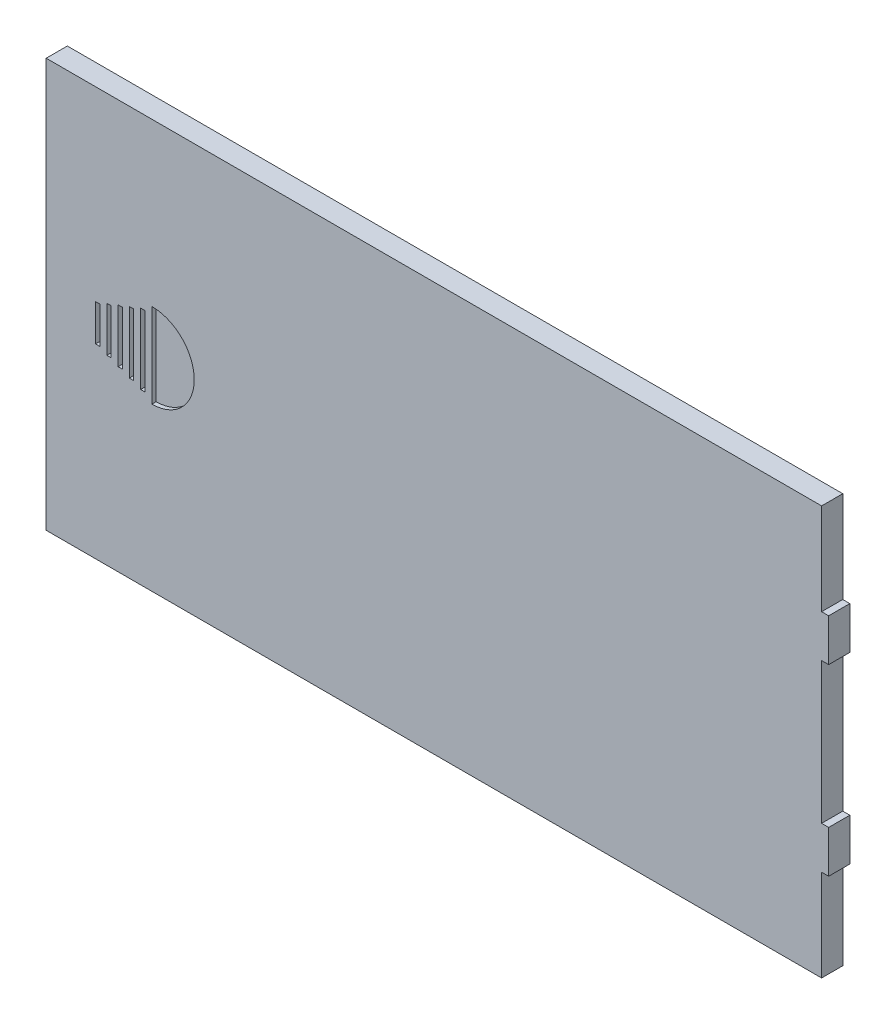
ISO-10303-21;
HEADER;
FILE_DESCRIPTION(('STEP AP214'),'2;1');
FILE_NAME('part.step','',(''),(''),'','','');
FILE_SCHEMA(('AUTOMOTIVE_DESIGN { 1 0 10303 214 1 1 1 1 }'));
ENDSEC;
DATA;
#1=APPLICATION_CONTEXT('core data for automotive mechanical design processes');
#2=APPLICATION_PROTOCOL_DEFINITION('international standard','automotive_design',2000,#1);
#3=PRODUCT_CONTEXT('',#1,'mechanical');
#4=PRODUCT('Part','Part','',(#3));
#5=PRODUCT_RELATED_PRODUCT_CATEGORY('part','',(#4));
#6=PRODUCT_DEFINITION_FORMATION('','',#4);
#7=PRODUCT_DEFINITION_CONTEXT('part definition',#1,'design');
#8=PRODUCT_DEFINITION('design','',#6,#7);
#9=PRODUCT_DEFINITION_SHAPE('','',#8);
#10=(LENGTH_UNIT() NAMED_UNIT(*) SI_UNIT(.MILLI.,.METRE.));
#11=(NAMED_UNIT(*) PLANE_ANGLE_UNIT() SI_UNIT($,.RADIAN.));
#12=(NAMED_UNIT(*) SI_UNIT($,.STERADIAN.) SOLID_ANGLE_UNIT());
#13=UNCERTAINTY_MEASURE_WITH_UNIT(LENGTH_MEASURE(1.E-05),#10,'distance_accuracy_value','');
#14=(GEOMETRIC_REPRESENTATION_CONTEXT(3) GLOBAL_UNCERTAINTY_ASSIGNED_CONTEXT((#13)) GLOBAL_UNIT_ASSIGNED_CONTEXT((#10,
#11,#12)) REPRESENTATION_CONTEXT('',''));
#15=CARTESIAN_POINT('',(0.,0.,0.));
#16=DIRECTION('',(0.,0.,1.));
#17=DIRECTION('',(1.,0.,0.));
#18=AXIS2_PLACEMENT_3D('',#15,#16,#17);
#19=CARTESIAN_POINT('',(27.5,-8.,1.5));
#20=DIRECTION('',(-1.,0.,0.));
#21=DIRECTION('',(0.,-1.,0.));
#22=AXIS2_PLACEMENT_3D('',#19,#20,#21);
#23=PLANE('',#22);
#24=DIRECTION('',(0.,1.,0.));
#25=VECTOR('',#24,1.);
#26=CARTESIAN_POINT('',(27.5,-8.,0.));
#27=LINE('',#26,#25);
#28=CARTESIAN_POINT('',(27.5,-14.5,0.));
#29=VERTEX_POINT('',#28);
#30=CARTESIAN_POINT('',(27.5,-8.,0.));
#31=VERTEX_POINT('',#30);
#32=EDGE_CURVE('E434',#29,#31,#27,.T.);
#33=ORIENTED_EDGE('',*,*,#32,.T.);
#34=DIRECTION('',(0.,0.,-1.));
#35=VECTOR('',#34,1.);
#36=CARTESIAN_POINT('',(27.5,-8.,1.5));
#37=LINE('',#36,#35);
#38=CARTESIAN_POINT('',(27.5,-8.,1.5));
#39=VERTEX_POINT('',#38);
#40=EDGE_CURVE('E11',#39,#31,#37,.T.);
#41=ORIENTED_EDGE('',*,*,#40,.F.);
#42=DIRECTION('',(0.,1.,0.));
#43=VECTOR('',#42,1.);
#44=CARTESIAN_POINT('',(27.5,-8.,1.5));
#45=LINE('',#44,#43);
#46=CARTESIAN_POINT('',(27.5,-14.5,1.5));
#47=VERTEX_POINT('',#46);
#48=EDGE_CURVE('E437',#47,#39,#45,.T.);
#49=ORIENTED_EDGE('',*,*,#48,.F.);
#50=DIRECTION('',(0.,0.,-1.));
#51=VECTOR('',#50,1.);
#52=CARTESIAN_POINT('',(27.5,-14.5,1.5));
#53=LINE('',#52,#51);
#54=EDGE_CURVE('E463',#47,#29,#53,.T.);
#55=ORIENTED_EDGE('',*,*,#54,.T.);
#56=EDGE_LOOP('',(#33,#41,#49,#55));
#57=FACE_BOUND('',#56,.T.);
#58=ADVANCED_FACE('F36',(#57),#23,.F.);
#59=CARTESIAN_POINT('',(27.5,-8.,1.5));
#60=DIRECTION('',(0.,1.,0.));
#61=DIRECTION('',(0.,0.,1.));
#62=AXIS2_PLACEMENT_3D('',#59,#60,#61);
#63=PLANE('',#62);
#64=DIRECTION('',(1.,0.,0.));
#65=VECTOR('',#64,1.);
#66=CARTESIAN_POINT('',(27.5,-8.,0.));
#67=LINE('',#66,#65);
#68=CARTESIAN_POINT('',(28.,-8.,0.));
#69=VERTEX_POINT('',#68);
#70=EDGE_CURVE('E466',#31,#69,#67,.T.);
#71=ORIENTED_EDGE('',*,*,#70,.T.);
#72=DIRECTION('',(0.,0.,-1.));
#73=VECTOR('',#72,1.);
#74=CARTESIAN_POINT('',(28.,-8.,1.5));
#75=LINE('',#74,#73);
#76=CARTESIAN_POINT('',(28.,-8.,1.5));
#77=VERTEX_POINT('',#76);
#78=EDGE_CURVE('E43',#77,#69,#75,.T.);
#79=ORIENTED_EDGE('',*,*,#78,.F.);
#80=DIRECTION('',(1.,0.,0.));
#81=VECTOR('',#80,1.);
#82=CARTESIAN_POINT('',(27.5,-8.,1.5));
#83=LINE('',#82,#81);
#84=EDGE_CURVE('E440',#39,#77,#83,.T.);
#85=ORIENTED_EDGE('',*,*,#84,.F.);
#86=ORIENTED_EDGE('',*,*,#40,.T.);
#87=EDGE_LOOP('',(#71,#79,#85,#86));
#88=FACE_BOUND('',#87,.T.);
#89=ADVANCED_FACE('F543',(#88),#63,.F.);
#90=CARTESIAN_POINT('',(28.,-8.,1.5));
#91=DIRECTION('',(-1.,0.,0.));
#92=DIRECTION('',(0.,0.,1.));
#93=AXIS2_PLACEMENT_3D('',#90,#91,#92);
#94=PLANE('',#93);
#95=DIRECTION('',(0.,1.,0.));
#96=VECTOR('',#95,1.);
#97=CARTESIAN_POINT('',(28.,-8.,0.));
#98=LINE('',#97,#96);
#99=CARTESIAN_POINT('',(28.,-4.99999999999999,0.));
#100=VERTEX_POINT('',#99);
#101=EDGE_CURVE('E468',#69,#100,#98,.T.);
#102=ORIENTED_EDGE('',*,*,#101,.T.);
#103=DIRECTION('',(0.,0.,-1.));
#104=VECTOR('',#103,1.);
#105=CARTESIAN_POINT('',(28.,-4.99999999999999,1.5));
#106=LINE('',#105,#104);
#107=CARTESIAN_POINT('',(28.,-4.99999999999999,1.5));
#108=VERTEX_POINT('',#107);
#109=EDGE_CURVE('E513',#108,#100,#106,.T.);
#110=ORIENTED_EDGE('',*,*,#109,.F.);
#111=DIRECTION('',(0.,1.,0.));
#112=VECTOR('',#111,1.);
#113=CARTESIAN_POINT('',(28.,-8.,1.5));
#114=LINE('',#113,#112);
#115=EDGE_CURVE('E443',#77,#108,#114,.T.);
#116=ORIENTED_EDGE('',*,*,#115,.F.);
#117=ORIENTED_EDGE('',*,*,#78,.T.);
#118=EDGE_LOOP('',(#102,#110,#116,#117));
#119=FACE_BOUND('',#118,.T.);
#120=ADVANCED_FACE('F520',(#119),#94,.F.);
#121=CARTESIAN_POINT('',(28.,-4.99999999999999,1.5));
#122=DIRECTION('',(0.,-1.,0.));
#123=DIRECTION('',(0.,0.,-1.));
#124=AXIS2_PLACEMENT_3D('',#121,#122,#123);
#125=PLANE('',#124);
#126=DIRECTION('',(-1.,0.,0.));
#127=VECTOR('',#126,1.);
#128=CARTESIAN_POINT('',(28.,-4.99999999999999,0.));
#129=LINE('',#128,#127);
#130=CARTESIAN_POINT('',(27.5,-4.99999999999999,0.));
#131=VERTEX_POINT('',#130);
#132=EDGE_CURVE('E470',#100,#131,#129,.T.);
#133=ORIENTED_EDGE('',*,*,#132,.T.);
#134=DIRECTION('',(0.,0.,-1.));
#135=VECTOR('',#134,1.);
#136=CARTESIAN_POINT('',(27.5,-4.99999999999999,1.5));
#137=LINE('',#136,#135);
#138=CARTESIAN_POINT('',(27.5,-4.99999999999999,1.5));
#139=VERTEX_POINT('',#138);
#140=EDGE_CURVE('E510',#139,#131,#137,.T.);
#141=ORIENTED_EDGE('',*,*,#140,.F.);
#142=DIRECTION('',(-1.,0.,0.));
#143=VECTOR('',#142,1.);
#144=CARTESIAN_POINT('',(28.,-4.99999999999999,1.5));
#145=LINE('',#144,#143);
#146=EDGE_CURVE('E445',#108,#139,#145,.T.);
#147=ORIENTED_EDGE('',*,*,#146,.F.);
#148=ORIENTED_EDGE('',*,*,#109,.T.);
#149=EDGE_LOOP('',(#133,#141,#147,#148));
#150=FACE_BOUND('',#149,.T.);
#151=ADVANCED_FACE('F531',(#150),#125,.F.);
#152=CARTESIAN_POINT('',(27.5,5.,1.5));
#153=DIRECTION('',(-1.,0.,0.));
#154=DIRECTION('',(0.,0.,1.));
#155=AXIS2_PLACEMENT_3D('',#152,#153,#154);
#156=PLANE('',#155);
#157=DIRECTION('',(0.,1.,0.));
#158=VECTOR('',#157,1.);
#159=CARTESIAN_POINT('',(27.5,5.,0.));
#160=LINE('',#159,#158);
#161=CARTESIAN_POINT('',(27.5,5.,0.));
#162=VERTEX_POINT('',#161);
#163=EDGE_CURVE('E472',#131,#162,#160,.T.);
#164=ORIENTED_EDGE('',*,*,#163,.T.);
#165=DIRECTION('',(0.,0.,-1.));
#166=VECTOR('',#165,1.);
#167=CARTESIAN_POINT('',(27.5,5.,1.5));
#168=LINE('',#167,#166);
#169=CARTESIAN_POINT('',(27.5,5.,1.5));
#170=VERTEX_POINT('',#169);
#171=EDGE_CURVE('E507',#170,#162,#168,.T.);
#172=ORIENTED_EDGE('',*,*,#171,.F.);
#173=DIRECTION('',(0.,1.,0.));
#174=VECTOR('',#173,1.);
#175=CARTESIAN_POINT('',(27.5,5.,1.5));
#176=LINE('',#175,#174);
#177=EDGE_CURVE('E447',#139,#170,#176,.T.);
#178=ORIENTED_EDGE('',*,*,#177,.F.);
#179=ORIENTED_EDGE('',*,*,#140,.T.);
#180=EDGE_LOOP('',(#164,#172,#178,#179));
#181=FACE_BOUND('',#180,.T.);
#182=ADVANCED_FACE('F535',(#181),#156,.F.);
#183=CARTESIAN_POINT('',(28.,5.,1.5));
#184=DIRECTION('',(0.,1.,0.));
#185=DIRECTION('',(0.,0.,1.));
#186=AXIS2_PLACEMENT_3D('',#183,#184,#185);
#187=PLANE('',#186);
#188=DIRECTION('',(1.,0.,0.));
#189=VECTOR('',#188,1.);
#190=CARTESIAN_POINT('',(28.,5.,0.));
#191=LINE('',#190,#189);
#192=CARTESIAN_POINT('',(28.,5.,0.));
#193=VERTEX_POINT('',#192);
#194=EDGE_CURVE('E474',#162,#193,#191,.T.);
#195=ORIENTED_EDGE('',*,*,#194,.T.);
#196=DIRECTION('',(0.,0.,-1.));
#197=VECTOR('',#196,1.);
#198=CARTESIAN_POINT('',(28.,5.,1.5));
#199=LINE('',#198,#197);
#200=CARTESIAN_POINT('',(28.,5.,1.5));
#201=VERTEX_POINT('',#200);
#202=EDGE_CURVE('E504',#201,#193,#199,.T.);
#203=ORIENTED_EDGE('',*,*,#202,.F.);
#204=DIRECTION('',(1.,0.,0.));
#205=VECTOR('',#204,1.);
#206=CARTESIAN_POINT('',(28.,5.,1.5));
#207=LINE('',#206,#205);
#208=EDGE_CURVE('E449',#170,#201,#207,.T.);
#209=ORIENTED_EDGE('',*,*,#208,.F.);
#210=ORIENTED_EDGE('',*,*,#171,.T.);
#211=EDGE_LOOP('',(#195,#203,#209,#210));
#212=FACE_BOUND('',#211,.T.);
#213=ADVANCED_FACE('F576',(#212),#187,.F.);
#214=CARTESIAN_POINT('',(28.,8.,1.5));
#215=DIRECTION('',(-1.,0.,0.));
#216=DIRECTION('',(0.,0.,1.));
#217=AXIS2_PLACEMENT_3D('',#214,#215,#216);
#218=PLANE('',#217);
#219=DIRECTION('',(0.,1.,0.));
#220=VECTOR('',#219,1.);
#221=CARTESIAN_POINT('',(28.,8.,0.));
#222=LINE('',#221,#220);
#223=CARTESIAN_POINT('',(28.,8.,0.));
#224=VERTEX_POINT('',#223);
#225=EDGE_CURVE('E476',#193,#224,#222,.T.);
#226=ORIENTED_EDGE('',*,*,#225,.T.);
#227=DIRECTION('',(0.,0.,-1.));
#228=VECTOR('',#227,1.);
#229=CARTESIAN_POINT('',(28.,8.,1.5));
#230=LINE('',#229,#228);
#231=CARTESIAN_POINT('',(28.,8.,1.5));
#232=VERTEX_POINT('',#231);
#233=EDGE_CURVE('E501',#232,#224,#230,.T.);
#234=ORIENTED_EDGE('',*,*,#233,.F.);
#235=DIRECTION('',(0.,1.,0.));
#236=VECTOR('',#235,1.);
#237=CARTESIAN_POINT('',(28.,8.,1.5));
#238=LINE('',#237,#236);
#239=EDGE_CURVE('E451',#201,#232,#238,.T.);
#240=ORIENTED_EDGE('',*,*,#239,.F.);
#241=ORIENTED_EDGE('',*,*,#202,.T.);
#242=EDGE_LOOP('',(#226,#234,#240,#241));
#243=FACE_BOUND('',#242,.T.);
#244=ADVANCED_FACE('F574',(#243),#218,.F.);
#245=CARTESIAN_POINT('',(27.5,8.,1.5));
#246=DIRECTION('',(0.,-1.,0.));
#247=DIRECTION('',(0.,0.,-1.));
#248=AXIS2_PLACEMENT_3D('',#245,#246,#247);
#249=PLANE('',#248);
#250=DIRECTION('',(-1.,0.,0.));
#251=VECTOR('',#250,1.);
#252=CARTESIAN_POINT('',(27.5,8.,0.));
#253=LINE('',#252,#251);
#254=CARTESIAN_POINT('',(27.5,8.,0.));
#255=VERTEX_POINT('',#254);
#256=EDGE_CURVE('E478',#224,#255,#253,.T.);
#257=ORIENTED_EDGE('',*,*,#256,.T.);
#258=DIRECTION('',(0.,0.,-1.));
#259=VECTOR('',#258,1.);
#260=CARTESIAN_POINT('',(27.5,8.,1.5));
#261=LINE('',#260,#259);
#262=CARTESIAN_POINT('',(27.5,8.,1.5));
#263=VERTEX_POINT('',#262);
#264=EDGE_CURVE('E498',#263,#255,#261,.T.);
#265=ORIENTED_EDGE('',*,*,#264,.F.);
#266=DIRECTION('',(-1.,0.,0.));
#267=VECTOR('',#266,1.);
#268=CARTESIAN_POINT('',(27.5,8.,1.5));
#269=LINE('',#268,#267);
#270=EDGE_CURVE('E453',#232,#263,#269,.T.);
#271=ORIENTED_EDGE('',*,*,#270,.F.);
#272=ORIENTED_EDGE('',*,*,#233,.T.);
#273=EDGE_LOOP('',(#257,#265,#271,#272));
#274=FACE_BOUND('',#273,.T.);
#275=ADVANCED_FACE('F570',(#274),#249,.F.);
#276=CARTESIAN_POINT('',(27.5,14.5,1.5));
#277=DIRECTION('',(-1.,0.,0.));
#278=DIRECTION('',(0.,-1.,0.));
#279=AXIS2_PLACEMENT_3D('',#276,#277,#278);
#280=PLANE('',#279);
#281=DIRECTION('',(0.,1.,0.));
#282=VECTOR('',#281,1.);
#283=CARTESIAN_POINT('',(27.5,14.5,0.));
#284=LINE('',#283,#282);
#285=CARTESIAN_POINT('',(27.5,14.5,0.));
#286=VERTEX_POINT('',#285);
#287=EDGE_CURVE('E480',#255,#286,#284,.T.);
#288=ORIENTED_EDGE('',*,*,#287,.T.);
#289=DIRECTION('',(0.,0.,-1.));
#290=VECTOR('',#289,1.);
#291=CARTESIAN_POINT('',(27.5,14.5,1.5));
#292=LINE('',#291,#290);
#293=CARTESIAN_POINT('',(27.5,14.5,1.5));
#294=VERTEX_POINT('',#293);
#295=EDGE_CURVE('E495',#294,#286,#292,.T.);
#296=ORIENTED_EDGE('',*,*,#295,.F.);
#297=DIRECTION('',(0.,1.,0.));
#298=VECTOR('',#297,1.);
#299=CARTESIAN_POINT('',(27.5,14.5,1.5));
#300=LINE('',#299,#298);
#301=EDGE_CURVE('E455',#263,#294,#300,.T.);
#302=ORIENTED_EDGE('',*,*,#301,.F.);
#303=ORIENTED_EDGE('',*,*,#264,.T.);
#304=EDGE_LOOP('',(#288,#296,#302,#303));
#305=FACE_BOUND('',#304,.T.);
#306=ADVANCED_FACE('F565',(#305),#280,.F.);
#307=CARTESIAN_POINT('',(-27.5,14.5,1.5));
#308=DIRECTION('',(0.,-1.,0.));
#309=DIRECTION('',(1.,0.,0.));
#310=AXIS2_PLACEMENT_3D('',#307,#308,#309);
#311=PLANE('',#310);
#312=DIRECTION('',(-1.,0.,0.));
#313=VECTOR('',#312,1.);
#314=CARTESIAN_POINT('',(-27.5,14.5,0.));
#315=LINE('',#314,#313);
#316=CARTESIAN_POINT('',(-27.5,14.5,0.));
#317=VERTEX_POINT('',#316);
#318=EDGE_CURVE('E482',#286,#317,#315,.T.);
#319=ORIENTED_EDGE('',*,*,#318,.T.);
#320=DIRECTION('',(0.,0.,-1.));
#321=VECTOR('',#320,1.);
#322=CARTESIAN_POINT('',(-27.5,14.5,1.5));
#323=LINE('',#322,#321);
#324=CARTESIAN_POINT('',(-27.5,14.5,1.5));
#325=VERTEX_POINT('',#324);
#326=EDGE_CURVE('E492',#325,#317,#323,.T.);
#327=ORIENTED_EDGE('',*,*,#326,.F.);
#328=DIRECTION('',(-1.,0.,0.));
#329=VECTOR('',#328,1.);
#330=CARTESIAN_POINT('',(-27.5,14.5,1.5));
#331=LINE('',#330,#329);
#332=EDGE_CURVE('E457',#294,#325,#331,.T.);
#333=ORIENTED_EDGE('',*,*,#332,.F.);
#334=ORIENTED_EDGE('',*,*,#295,.T.);
#335=EDGE_LOOP('',(#319,#327,#333,#334));
#336=FACE_BOUND('',#335,.T.);
#337=ADVANCED_FACE('F559',(#336),#311,.F.);
#338=CARTESIAN_POINT('',(-27.5,14.5,1.5));
#339=DIRECTION('',(1.,0.,0.));
#340=DIRECTION('',(0.,1.,0.));
#341=AXIS2_PLACEMENT_3D('',#338,#339,#340);
#342=PLANE('',#341);
#343=DIRECTION('',(0.,-1.,0.));
#344=VECTOR('',#343,1.);
#345=CARTESIAN_POINT('',(-27.5,14.5,0.));
#346=LINE('',#345,#344);
#347=CARTESIAN_POINT('',(-27.5,-14.5,0.));
#348=VERTEX_POINT('',#347);
#349=EDGE_CURVE('E484',#317,#348,#346,.T.);
#350=ORIENTED_EDGE('',*,*,#349,.T.);
#351=DIRECTION('',(0.,0.,-1.));
#352=VECTOR('',#351,1.);
#353=CARTESIAN_POINT('',(-27.5,-14.5,1.5));
#354=LINE('',#353,#352);
#355=CARTESIAN_POINT('',(-27.5,-14.5,1.5));
#356=VERTEX_POINT('',#355);
#357=EDGE_CURVE('E489',#356,#348,#354,.T.);
#358=ORIENTED_EDGE('',*,*,#357,.F.);
#359=DIRECTION('',(0.,-1.,0.));
#360=VECTOR('',#359,1.);
#361=CARTESIAN_POINT('',(-27.5,14.5,1.5));
#362=LINE('',#361,#360);
#363=EDGE_CURVE('E459',#325,#356,#362,.T.);
#364=ORIENTED_EDGE('',*,*,#363,.F.);
#365=ORIENTED_EDGE('',*,*,#326,.T.);
#366=EDGE_LOOP('',(#350,#358,#364,#365));
#367=FACE_BOUND('',#366,.T.);
#368=ADVANCED_FACE('F555',(#367),#342,.F.);
#369=CARTESIAN_POINT('',(-27.5,-14.5,1.5));
#370=DIRECTION('',(0.,1.,0.));
#371=DIRECTION('',(-1.,0.,0.));
#372=AXIS2_PLACEMENT_3D('',#369,#370,#371);
#373=PLANE('',#372);
#374=DIRECTION('',(1.,0.,0.));
#375=VECTOR('',#374,1.);
#376=CARTESIAN_POINT('',(-27.5,-14.5,0.));
#377=LINE('',#376,#375);
#378=EDGE_CURVE('E441',#348,#29,#377,.T.);
#379=ORIENTED_EDGE('',*,*,#378,.T.);
#380=ORIENTED_EDGE('',*,*,#54,.F.);
#381=DIRECTION('',(1.,0.,0.));
#382=VECTOR('',#381,1.);
#383=CARTESIAN_POINT('',(-27.5,-14.5,1.5));
#384=LINE('',#383,#382);
#385=EDGE_CURVE('E461',#356,#47,#384,.T.);
#386=ORIENTED_EDGE('',*,*,#385,.F.);
#387=ORIENTED_EDGE('',*,*,#357,.T.);
#388=EDGE_LOOP('',(#379,#380,#386,#387));
#389=FACE_BOUND('',#388,.T.);
#390=ADVANCED_FACE('F550',(#389),#373,.F.);
#391=CARTESIAN_POINT('',(0.,0.,1.5));
#392=DIRECTION('',(0.,0.,1.));
#393=DIRECTION('',(1.,0.,0.));
#394=AXIS2_PLACEMENT_3D('',#391,#392,#393);
#395=PLANE('',#394);
#396=DIRECTION('',(0.,-1.,0.));
#397=VECTOR('',#396,1.);
#398=CARTESIAN_POINT('',(-20.8,-2.5,1.5));
#399=LINE('',#398,#397);
#400=CARTESIAN_POINT('',(-20.8,2.5,1.5));
#401=VERTEX_POINT('',#400);
#402=CARTESIAN_POINT('',(-20.8,-2.5,1.5));
#403=VERTEX_POINT('',#402);
#404=EDGE_CURVE('E50',#401,#403,#399,.T.);
#405=ORIENTED_EDGE('',*,*,#404,.F.);
#406=DIRECTION('',(-1.,0.,0.));
#407=VECTOR('',#406,1.);
#408=CARTESIAN_POINT('',(-20.5,2.5,1.5));
#409=LINE('',#408,#407);
#410=CARTESIAN_POINT('',(-20.5,2.5,1.5));
#411=VERTEX_POINT('',#410);
#412=EDGE_CURVE('E276',#411,#401,#409,.T.);
#413=ORIENTED_EDGE('',*,*,#412,.F.);
#414=DIRECTION('',(0.,1.,0.));
#415=VECTOR('',#414,1.);
#416=CARTESIAN_POINT('',(-20.5,-2.5,1.5));
#417=LINE('',#416,#415);
#418=CARTESIAN_POINT('',(-20.5,-2.5,1.5));
#419=VERTEX_POINT('',#418);
#420=EDGE_CURVE('E279',#419,#411,#417,.T.);
#421=ORIENTED_EDGE('',*,*,#420,.F.);
#422=DIRECTION('',(1.,0.,0.));
#423=VECTOR('',#422,1.);
#424=CARTESIAN_POINT('',(-20.5,-2.5,1.5));
#425=LINE('',#424,#423);
#426=EDGE_CURVE('E285',#403,#419,#425,.T.);
#427=ORIENTED_EDGE('',*,*,#426,.F.);
#428=EDGE_LOOP('',(#405,#413,#421,#427));
#429=FACE_BOUND('',#428,.T.);
#430=DIRECTION('',(0.,-1.,0.));
#431=VECTOR('',#430,1.);
#432=CARTESIAN_POINT('',(-21.6,-2.2,1.5));
#433=LINE('',#432,#431);
#434=CARTESIAN_POINT('',(-21.6,2.2,1.5));
#435=VERTEX_POINT('',#434);
#436=CARTESIAN_POINT('',(-21.6,-2.2,1.5));
#437=VERTEX_POINT('',#436);
#438=EDGE_CURVE('E58',#435,#437,#433,.T.);
#439=ORIENTED_EDGE('',*,*,#438,.F.);
#440=DIRECTION('',(-1.,0.,0.));
#441=VECTOR('',#440,1.);
#442=CARTESIAN_POINT('',(-21.3,2.2,1.5));
#443=LINE('',#442,#441);
#444=CARTESIAN_POINT('',(-21.3,2.2,1.5));
#445=VERTEX_POINT('',#444);
#446=EDGE_CURVE('E300',#445,#435,#443,.T.);
#447=ORIENTED_EDGE('',*,*,#446,.F.);
#448=DIRECTION('',(0.,1.,0.));
#449=VECTOR('',#448,1.);
#450=CARTESIAN_POINT('',(-21.3,-2.2,1.5));
#451=LINE('',#450,#449);
#452=CARTESIAN_POINT('',(-21.3,-2.2,1.5));
#453=VERTEX_POINT('',#452);
#454=EDGE_CURVE('E315',#453,#445,#451,.T.);
#455=ORIENTED_EDGE('',*,*,#454,.F.);
#456=DIRECTION('',(1.,0.,0.));
#457=VECTOR('',#456,1.);
#458=CARTESIAN_POINT('',(-21.3,-2.2,1.5));
#459=LINE('',#458,#457);
#460=EDGE_CURVE('E311',#437,#453,#459,.T.);
#461=ORIENTED_EDGE('',*,*,#460,.F.);
#462=EDGE_LOOP('',(#439,#447,#455,#461));
#463=FACE_BOUND('',#462,.T.);
#464=DIRECTION('',(0.,-1.,0.));
#465=VECTOR('',#464,1.);
#466=CARTESIAN_POINT('',(-22.4,-1.9,1.5));
#467=LINE('',#466,#465);
#468=CARTESIAN_POINT('',(-22.4,1.9,1.5));
#469=VERTEX_POINT('',#468);
#470=CARTESIAN_POINT('',(-22.4,-1.9,1.5));
#471=VERTEX_POINT('',#470);
#472=EDGE_CURVE('E340',#469,#471,#467,.T.);
#473=ORIENTED_EDGE('',*,*,#472,.F.);
#474=DIRECTION('',(-1.,0.,0.));
#475=VECTOR('',#474,1.);
#476=CARTESIAN_POINT('',(-22.1,1.9,1.5));
#477=LINE('',#476,#475);
#478=CARTESIAN_POINT('',(-22.1,1.9,1.5));
#479=VERTEX_POINT('',#478);
#480=EDGE_CURVE('E330',#479,#469,#477,.T.);
#481=ORIENTED_EDGE('',*,*,#480,.F.);
#482=DIRECTION('',(0.,1.,0.));
#483=VECTOR('',#482,1.);
#484=CARTESIAN_POINT('',(-22.1,-1.9,1.5));
#485=LINE('',#484,#483);
#486=CARTESIAN_POINT('',(-22.1,-1.9,1.5));
#487=VERTEX_POINT('',#486);
#488=EDGE_CURVE('E346',#487,#479,#485,.T.);
#489=ORIENTED_EDGE('',*,*,#488,.F.);
#490=DIRECTION('',(1.,0.,0.));
#491=VECTOR('',#490,1.);
#492=CARTESIAN_POINT('',(-22.1,-1.9,1.5));
#493=LINE('',#492,#491);
#494=EDGE_CURVE('E342',#471,#487,#493,.T.);
#495=ORIENTED_EDGE('',*,*,#494,.F.);
#496=EDGE_LOOP('',(#473,#481,#489,#495));
#497=FACE_BOUND('',#496,.T.);
#498=DIRECTION('',(0.,-1.,0.));
#499=VECTOR('',#498,1.);
#500=CARTESIAN_POINT('',(-23.2,-1.6,1.5));
#501=LINE('',#500,#499);
#502=CARTESIAN_POINT('',(-23.2,1.6,1.5));
#503=VERTEX_POINT('',#502);
#504=CARTESIAN_POINT('',(-23.2,-1.6,1.5));
#505=VERTEX_POINT('',#504);
#506=EDGE_CURVE('E372',#503,#505,#501,.T.);
#507=ORIENTED_EDGE('',*,*,#506,.F.);
#508=DIRECTION('',(-1.,0.,0.));
#509=VECTOR('',#508,1.);
#510=CARTESIAN_POINT('',(-22.9,1.6,1.5));
#511=LINE('',#510,#509);
#512=CARTESIAN_POINT('',(-22.9,1.6,1.5));
#513=VERTEX_POINT('',#512);
#514=EDGE_CURVE('E362',#513,#503,#511,.T.);
#515=ORIENTED_EDGE('',*,*,#514,.F.);
#516=DIRECTION('',(0.,1.,0.));
#517=VECTOR('',#516,1.);
#518=CARTESIAN_POINT('',(-22.9,-1.6,1.5));
#519=LINE('',#518,#517);
#520=CARTESIAN_POINT('',(-22.9,-1.6,1.5));
#521=VERTEX_POINT('',#520);
#522=EDGE_CURVE('E378',#521,#513,#519,.T.);
#523=ORIENTED_EDGE('',*,*,#522,.F.);
#524=DIRECTION('',(1.,0.,0.));
#525=VECTOR('',#524,1.);
#526=CARTESIAN_POINT('',(-22.9,-1.6,1.5));
#527=LINE('',#526,#525);
#528=EDGE_CURVE('E374',#505,#521,#527,.T.);
#529=ORIENTED_EDGE('',*,*,#528,.F.);
#530=EDGE_LOOP('',(#507,#515,#523,#529));
#531=FACE_BOUND('',#530,.T.);
#532=DIRECTION('',(0.,-1.,0.));
#533=VECTOR('',#532,1.);
#534=CARTESIAN_POINT('',(-24.,-1.3,1.5));
#535=LINE('',#534,#533);
#536=CARTESIAN_POINT('',(-24.,1.3,1.5));
#537=VERTEX_POINT('',#536);
#538=CARTESIAN_POINT('',(-24.,-1.3,1.5));
#539=VERTEX_POINT('',#538);
#540=EDGE_CURVE('E404',#537,#539,#535,.T.);
#541=ORIENTED_EDGE('',*,*,#540,.F.);
#542=DIRECTION('',(-1.,0.,0.));
#543=VECTOR('',#542,1.);
#544=CARTESIAN_POINT('',(-23.7,1.3,1.5));
#545=LINE('',#544,#543);
#546=CARTESIAN_POINT('',(-23.7,1.3,1.5));
#547=VERTEX_POINT('',#546);
#548=EDGE_CURVE('E394',#547,#537,#545,.T.);
#549=ORIENTED_EDGE('',*,*,#548,.F.);
#550=DIRECTION('',(0.,1.,0.));
#551=VECTOR('',#550,1.);
#552=CARTESIAN_POINT('',(-23.7,-1.3,1.5));
#553=LINE('',#552,#551);
#554=CARTESIAN_POINT('',(-23.7,-1.3,1.5));
#555=VERTEX_POINT('',#554);
#556=EDGE_CURVE('E409',#555,#547,#553,.T.);
#557=ORIENTED_EDGE('',*,*,#556,.F.);
#558=DIRECTION('',(1.,0.,0.));
#559=VECTOR('',#558,1.);
#560=CARTESIAN_POINT('',(-23.7,-1.3,1.5));
#561=LINE('',#560,#559);
#562=EDGE_CURVE('E406',#539,#555,#561,.T.);
#563=ORIENTED_EDGE('',*,*,#562,.F.);
#564=EDGE_LOOP('',(#541,#549,#557,#563));
#565=FACE_BOUND('',#564,.T.);
#566=CARTESIAN_POINT('',(-20.,0.,1.5));
#567=DIRECTION('',(0.,0.,1.));
#568=DIRECTION('',(1.,0.,0.));
#569=AXIS2_PLACEMENT_3D('',#566,#567,#568);
#570=CIRCLE('',#569,3.);
#571=CARTESIAN_POINT('',(-20.,-3.,1.5));
#572=VERTEX_POINT('',#571);
#573=CARTESIAN_POINT('',(-20.,3.,1.5));
#574=VERTEX_POINT('',#573);
#575=EDGE_CURVE('E292',#572,#574,#570,.T.);
#576=ORIENTED_EDGE('',*,*,#575,.F.);
#577=DIRECTION('',(0.,-1.,0.));
#578=VECTOR('',#577,1.);
#579=CARTESIAN_POINT('',(-20.,3.,1.5));
#580=LINE('',#579,#578);
#581=EDGE_CURVE('E425',#574,#572,#580,.T.);
#582=ORIENTED_EDGE('',*,*,#581,.F.);
#583=EDGE_LOOP('',(#576,#582));
#584=FACE_BOUND('',#583,.T.);
#585=ORIENTED_EDGE('',*,*,#48,.T.);
#586=ORIENTED_EDGE('',*,*,#84,.T.);
#587=ORIENTED_EDGE('',*,*,#115,.T.);
#588=ORIENTED_EDGE('',*,*,#146,.T.);
#589=ORIENTED_EDGE('',*,*,#177,.T.);
#590=ORIENTED_EDGE('',*,*,#208,.T.);
#591=ORIENTED_EDGE('',*,*,#239,.T.);
#592=ORIENTED_EDGE('',*,*,#270,.T.);
#593=ORIENTED_EDGE('',*,*,#301,.T.);
#594=ORIENTED_EDGE('',*,*,#332,.T.);
#595=ORIENTED_EDGE('',*,*,#363,.T.);
#596=ORIENTED_EDGE('',*,*,#385,.T.);
#597=EDGE_LOOP('',(#585,#586,#587,#588,#589,#590,#591,#592,#593,#594,#595,#596));
#598=FACE_BOUND('',#597,.T.);
#599=ADVANCED_FACE('F539',(#429,#463,#497,#531,#565,#584,#598),#395,.T.);
#600=CARTESIAN_POINT('',(0.,0.,0.));
#601=DIRECTION('',(0.,0.,1.));
#602=DIRECTION('',(1.,0.,0.));
#603=AXIS2_PLACEMENT_3D('',#600,#601,#602);
#604=PLANE('',#603);
#605=ORIENTED_EDGE('',*,*,#32,.F.);
#606=ORIENTED_EDGE('',*,*,#378,.F.);
#607=ORIENTED_EDGE('',*,*,#349,.F.);
#608=ORIENTED_EDGE('',*,*,#318,.F.);
#609=ORIENTED_EDGE('',*,*,#287,.F.);
#610=ORIENTED_EDGE('',*,*,#256,.F.);
#611=ORIENTED_EDGE('',*,*,#225,.F.);
#612=ORIENTED_EDGE('',*,*,#194,.F.);
#613=ORIENTED_EDGE('',*,*,#163,.F.);
#614=ORIENTED_EDGE('',*,*,#132,.F.);
#615=ORIENTED_EDGE('',*,*,#101,.F.);
#616=ORIENTED_EDGE('',*,*,#70,.F.);
#617=EDGE_LOOP('',(#605,#606,#607,#608,#609,#610,#611,#612,#613,#614,#615,#616));
#618=FACE_BOUND('',#617,.T.);
#619=ADVANCED_FACE('F526',(#618),#604,.F.);
#620=CARTESIAN_POINT('',(-20.,0.,1.2));
#621=DIRECTION('',(0.,0.,1.));
#622=DIRECTION('',(1.,0.,0.));
#623=AXIS2_PLACEMENT_3D('',#620,#621,#622);
#624=CYLINDRICAL_SURFACE('',#623,3.);
#625=ORIENTED_EDGE('',*,*,#575,.T.);
#626=DIRECTION('',(0.,0.,1.));
#627=VECTOR('',#626,1.);
#628=CARTESIAN_POINT('',(-20.,3.,1.2));
#629=LINE('',#628,#627);
#630=CARTESIAN_POINT('',(-20.,3.,1.2));
#631=VERTEX_POINT('',#630);
#632=EDGE_CURVE('E428',#631,#574,#629,.T.);
#633=ORIENTED_EDGE('',*,*,#632,.F.);
#634=CARTESIAN_POINT('',(-20.,0.,1.2));
#635=DIRECTION('',(0.,0.,1.));
#636=DIRECTION('',(1.,0.,0.));
#637=AXIS2_PLACEMENT_3D('',#634,#635,#636);
#638=CIRCLE('',#637,3.);
#639=CARTESIAN_POINT('',(-20.,-3.,1.2));
#640=VERTEX_POINT('',#639);
#641=EDGE_CURVE('E421',#640,#631,#638,.T.);
#642=ORIENTED_EDGE('',*,*,#641,.F.);
#643=DIRECTION('',(0.,0.,1.));
#644=VECTOR('',#643,1.);
#645=CARTESIAN_POINT('',(-20.,-3.,1.2));
#646=LINE('',#645,#644);
#647=EDGE_CURVE('E432',#640,#572,#646,.T.);
#648=ORIENTED_EDGE('',*,*,#647,.T.);
#649=EDGE_LOOP('',(#625,#633,#642,#648));
#650=FACE_BOUND('',#649,.T.);
#651=ADVANCED_FACE('F664',(#650),#624,.F.);
#652=CARTESIAN_POINT('',(-20.,3.,1.2));
#653=DIRECTION('',(-1.,0.,0.));
#654=DIRECTION('',(0.,0.,1.));
#655=AXIS2_PLACEMENT_3D('',#652,#653,#654);
#656=PLANE('',#655);
#657=ORIENTED_EDGE('',*,*,#581,.T.);
#658=ORIENTED_EDGE('',*,*,#647,.F.);
#659=DIRECTION('',(0.,-1.,0.));
#660=VECTOR('',#659,1.);
#661=CARTESIAN_POINT('',(-20.,3.,1.2));
#662=LINE('',#661,#660);
#663=EDGE_CURVE('E424',#631,#640,#662,.T.);
#664=ORIENTED_EDGE('',*,*,#663,.F.);
#665=ORIENTED_EDGE('',*,*,#632,.T.);
#666=EDGE_LOOP('',(#657,#658,#664,#665));
#667=FACE_BOUND('',#666,.T.);
#668=ADVANCED_FACE('F680',(#667),#656,.F.);
#669=CARTESIAN_POINT('',(-20.,0.,1.2));
#670=DIRECTION('',(0.,0.,1.));
#671=DIRECTION('',(1.,0.,0.));
#672=AXIS2_PLACEMENT_3D('',#669,#670,#671);
#673=PLANE('',#672);
#674=ORIENTED_EDGE('',*,*,#641,.T.);
#675=ORIENTED_EDGE('',*,*,#663,.T.);
#676=EDGE_LOOP('',(#674,#675));
#677=FACE_BOUND('',#676,.T.);
#678=ADVANCED_FACE('F690',(#677),#673,.T.);
#679=CARTESIAN_POINT('',(-24.,-1.3,1.2));
#680=DIRECTION('',(-1.,0.,0.));
#681=DIRECTION('',(0.,0.,1.));
#682=AXIS2_PLACEMENT_3D('',#679,#680,#681);
#683=PLANE('',#682);
#684=ORIENTED_EDGE('',*,*,#540,.T.);
#685=DIRECTION('',(0.,0.,1.));
#686=VECTOR('',#685,1.);
#687=CARTESIAN_POINT('',(-24.,-1.3,1.2));
#688=LINE('',#687,#686);
#689=CARTESIAN_POINT('',(-24.,-1.3,1.2));
#690=VERTEX_POINT('',#689);
#691=EDGE_CURVE('E403',#690,#539,#688,.T.);
#692=ORIENTED_EDGE('',*,*,#691,.F.);
#693=DIRECTION('',(0.,-1.,0.));
#694=VECTOR('',#693,1.);
#695=CARTESIAN_POINT('',(-24.,-1.3,1.2));
#696=LINE('',#695,#694);
#697=CARTESIAN_POINT('',(-24.,1.3,1.2));
#698=VERTEX_POINT('',#697);
#699=EDGE_CURVE('E390',#698,#690,#696,.T.);
#700=ORIENTED_EDGE('',*,*,#699,.F.);
#701=DIRECTION('',(0.,0.,1.));
#702=VECTOR('',#701,1.);
#703=CARTESIAN_POINT('',(-24.,1.3,1.2));
#704=LINE('',#703,#702);
#705=EDGE_CURVE('E375',#698,#537,#704,.T.);
#706=ORIENTED_EDGE('',*,*,#705,.T.);
#707=EDGE_LOOP('',(#684,#692,#700,#706));
#708=FACE_BOUND('',#707,.T.);
#709=ADVANCED_FACE('F700',(#708),#683,.F.);
#710=CARTESIAN_POINT('',(-23.7,1.3,1.2));
#711=DIRECTION('',(0.,1.,0.));
#712=DIRECTION('',(0.,0.,1.));
#713=AXIS2_PLACEMENT_3D('',#710,#711,#712);
#714=PLANE('',#713);
#715=ORIENTED_EDGE('',*,*,#548,.T.);
#716=ORIENTED_EDGE('',*,*,#705,.F.);
#717=DIRECTION('',(-1.,0.,0.));
#718=VECTOR('',#717,1.);
#719=CARTESIAN_POINT('',(-23.7,1.3,1.2));
#720=LINE('',#719,#718);
#721=CARTESIAN_POINT('',(-23.7,1.3,1.2));
#722=VERTEX_POINT('',#721);
#723=EDGE_CURVE('E400',#722,#698,#720,.T.);
#724=ORIENTED_EDGE('',*,*,#723,.F.);
#725=DIRECTION('',(0.,0.,1.));
#726=VECTOR('',#725,1.);
#727=CARTESIAN_POINT('',(-23.7,1.3,1.2));
#728=LINE('',#727,#726);
#729=EDGE_CURVE('E415',#722,#547,#728,.T.);
#730=ORIENTED_EDGE('',*,*,#729,.T.);
#731=EDGE_LOOP('',(#715,#716,#724,#730));
#732=FACE_BOUND('',#731,.T.);
#733=ADVANCED_FACE('F710',(#732),#714,.F.);
#734=CARTESIAN_POINT('',(-23.7,-1.3,1.2));
#735=DIRECTION('',(1.,0.,0.));
#736=DIRECTION('',(0.,0.,-1.));
#737=AXIS2_PLACEMENT_3D('',#734,#735,#736);
#738=PLANE('',#737);
#739=ORIENTED_EDGE('',*,*,#556,.T.);
#740=ORIENTED_EDGE('',*,*,#729,.F.);
#741=DIRECTION('',(0.,1.,0.));
#742=VECTOR('',#741,1.);
#743=CARTESIAN_POINT('',(-23.7,-1.3,1.2));
#744=LINE('',#743,#742);
#745=CARTESIAN_POINT('',(-23.7,-1.3,1.2));
#746=VERTEX_POINT('',#745);
#747=EDGE_CURVE('E397',#746,#722,#744,.T.);
#748=ORIENTED_EDGE('',*,*,#747,.F.);
#749=DIRECTION('',(0.,0.,1.));
#750=VECTOR('',#749,1.);
#751=CARTESIAN_POINT('',(-23.7,-1.3,1.2));
#752=LINE('',#751,#750);
#753=EDGE_CURVE('E417',#746,#555,#752,.T.);
#754=ORIENTED_EDGE('',*,*,#753,.T.);
#755=EDGE_LOOP('',(#739,#740,#748,#754));
#756=FACE_BOUND('',#755,.T.);
#757=ADVANCED_FACE('F720',(#756),#738,.F.);
#758=CARTESIAN_POINT('',(-23.7,-1.3,1.2));
#759=DIRECTION('',(0.,-1.,0.));
#760=DIRECTION('',(0.,0.,-1.));
#761=AXIS2_PLACEMENT_3D('',#758,#759,#760);
#762=PLANE('',#761);
#763=ORIENTED_EDGE('',*,*,#562,.T.);
#764=ORIENTED_EDGE('',*,*,#753,.F.);
#765=DIRECTION('',(1.,0.,0.));
#766=VECTOR('',#765,1.);
#767=CARTESIAN_POINT('',(-23.7,-1.3,1.2));
#768=LINE('',#767,#766);
#769=EDGE_CURVE('E393',#690,#746,#768,.T.);
#770=ORIENTED_EDGE('',*,*,#769,.F.);
#771=ORIENTED_EDGE('',*,*,#691,.T.);
#772=EDGE_LOOP('',(#763,#764,#770,#771));
#773=FACE_BOUND('',#772,.T.);
#774=ADVANCED_FACE('F730',(#773),#762,.F.);
#775=CARTESIAN_POINT('',(0.,0.,1.2));
#776=DIRECTION('',(0.,0.,1.));
#777=DIRECTION('',(1.,0.,0.));
#778=AXIS2_PLACEMENT_3D('',#775,#776,#777);
#779=PLANE('',#778);
#780=ORIENTED_EDGE('',*,*,#699,.T.);
#781=ORIENTED_EDGE('',*,*,#769,.T.);
#782=ORIENTED_EDGE('',*,*,#747,.T.);
#783=ORIENTED_EDGE('',*,*,#723,.T.);
#784=EDGE_LOOP('',(#780,#781,#782,#783));
#785=FACE_BOUND('',#784,.T.);
#786=ADVANCED_FACE('F740',(#785),#779,.T.);
#787=CARTESIAN_POINT('',(-23.2,-1.6,1.2));
#788=DIRECTION('',(-1.,0.,0.));
#789=DIRECTION('',(0.,0.,1.));
#790=AXIS2_PLACEMENT_3D('',#787,#788,#789);
#791=PLANE('',#790);
#792=ORIENTED_EDGE('',*,*,#506,.T.);
#793=DIRECTION('',(0.,0.,1.));
#794=VECTOR('',#793,1.);
#795=CARTESIAN_POINT('',(-23.2,-1.6,1.2));
#796=LINE('',#795,#794);
#797=CARTESIAN_POINT('',(-23.2,-1.6,1.2));
#798=VERTEX_POINT('',#797);
#799=EDGE_CURVE('E371',#798,#505,#796,.T.);
#800=ORIENTED_EDGE('',*,*,#799,.F.);
#801=DIRECTION('',(0.,-1.,0.));
#802=VECTOR('',#801,1.);
#803=CARTESIAN_POINT('',(-23.2,-1.6,1.2));
#804=LINE('',#803,#802);
#805=CARTESIAN_POINT('',(-23.2,1.6,1.2));
#806=VERTEX_POINT('',#805);
#807=EDGE_CURVE('E358',#806,#798,#804,.T.);
#808=ORIENTED_EDGE('',*,*,#807,.F.);
#809=DIRECTION('',(0.,0.,1.));
#810=VECTOR('',#809,1.);
#811=CARTESIAN_POINT('',(-23.2,1.6,1.2));
#812=LINE('',#811,#810);
#813=EDGE_CURVE('E343',#806,#503,#812,.T.);
#814=ORIENTED_EDGE('',*,*,#813,.T.);
#815=EDGE_LOOP('',(#792,#800,#808,#814));
#816=FACE_BOUND('',#815,.T.);
#817=ADVANCED_FACE('F750',(#816),#791,.F.);
#818=CARTESIAN_POINT('',(-22.9,1.6,1.2));
#819=DIRECTION('',(0.,1.,0.));
#820=DIRECTION('',(0.,0.,1.));
#821=AXIS2_PLACEMENT_3D('',#818,#819,#820);
#822=PLANE('',#821);
#823=ORIENTED_EDGE('',*,*,#514,.T.);
#824=ORIENTED_EDGE('',*,*,#813,.F.);
#825=DIRECTION('',(-1.,0.,0.));
#826=VECTOR('',#825,1.);
#827=CARTESIAN_POINT('',(-22.9,1.6,1.2));
#828=LINE('',#827,#826);
#829=CARTESIAN_POINT('',(-22.9,1.6,1.2));
#830=VERTEX_POINT('',#829);
#831=EDGE_CURVE('E368',#830,#806,#828,.T.);
#832=ORIENTED_EDGE('',*,*,#831,.F.);
#833=DIRECTION('',(0.,0.,1.));
#834=VECTOR('',#833,1.);
#835=CARTESIAN_POINT('',(-22.9,1.6,1.2));
#836=LINE('',#835,#834);
#837=EDGE_CURVE('E384',#830,#513,#836,.T.);
#838=ORIENTED_EDGE('',*,*,#837,.T.);
#839=EDGE_LOOP('',(#823,#824,#832,#838));
#840=FACE_BOUND('',#839,.T.);
#841=ADVANCED_FACE('F760',(#840),#822,.F.);
#842=CARTESIAN_POINT('',(-22.9,-1.6,1.2));
#843=DIRECTION('',(1.,0.,0.));
#844=DIRECTION('',(0.,0.,-1.));
#845=AXIS2_PLACEMENT_3D('',#842,#843,#844);
#846=PLANE('',#845);
#847=ORIENTED_EDGE('',*,*,#522,.T.);
#848=ORIENTED_EDGE('',*,*,#837,.F.);
#849=DIRECTION('',(0.,1.,0.));
#850=VECTOR('',#849,1.);
#851=CARTESIAN_POINT('',(-22.9,-1.6,1.2));
#852=LINE('',#851,#850);
#853=CARTESIAN_POINT('',(-22.9,-1.6,1.2));
#854=VERTEX_POINT('',#853);
#855=EDGE_CURVE('E365',#854,#830,#852,.T.);
#856=ORIENTED_EDGE('',*,*,#855,.F.);
#857=DIRECTION('',(0.,0.,1.));
#858=VECTOR('',#857,1.);
#859=CARTESIAN_POINT('',(-22.9,-1.6,1.2));
#860=LINE('',#859,#858);
#861=EDGE_CURVE('E386',#854,#521,#860,.T.);
#862=ORIENTED_EDGE('',*,*,#861,.T.);
#863=EDGE_LOOP('',(#847,#848,#856,#862));
#864=FACE_BOUND('',#863,.T.);
#865=ADVANCED_FACE('F770',(#864),#846,.F.);
#866=CARTESIAN_POINT('',(-22.9,-1.6,1.2));
#867=DIRECTION('',(0.,-1.,0.));
#868=DIRECTION('',(0.,0.,-1.));
#869=AXIS2_PLACEMENT_3D('',#866,#867,#868);
#870=PLANE('',#869);
#871=ORIENTED_EDGE('',*,*,#528,.T.);
#872=ORIENTED_EDGE('',*,*,#861,.F.);
#873=DIRECTION('',(1.,0.,0.));
#874=VECTOR('',#873,1.);
#875=CARTESIAN_POINT('',(-22.9,-1.6,1.2));
#876=LINE('',#875,#874);
#877=EDGE_CURVE('E361',#798,#854,#876,.T.);
#878=ORIENTED_EDGE('',*,*,#877,.F.);
#879=ORIENTED_EDGE('',*,*,#799,.T.);
#880=EDGE_LOOP('',(#871,#872,#878,#879));
#881=FACE_BOUND('',#880,.T.);
#882=ADVANCED_FACE('F780',(#881),#870,.F.);
#883=CARTESIAN_POINT('',(0.,0.,1.2));
#884=DIRECTION('',(0.,0.,1.));
#885=DIRECTION('',(1.,0.,0.));
#886=AXIS2_PLACEMENT_3D('',#883,#884,#885);
#887=PLANE('',#886);
#888=ORIENTED_EDGE('',*,*,#807,.T.);
#889=ORIENTED_EDGE('',*,*,#877,.T.);
#890=ORIENTED_EDGE('',*,*,#855,.T.);
#891=ORIENTED_EDGE('',*,*,#831,.T.);
#892=EDGE_LOOP('',(#888,#889,#890,#891));
#893=FACE_BOUND('',#892,.T.);
#894=ADVANCED_FACE('F790',(#893),#887,.T.);
#895=CARTESIAN_POINT('',(-22.4,-1.9,1.2));
#896=DIRECTION('',(-1.,0.,0.));
#897=DIRECTION('',(0.,0.,1.));
#898=AXIS2_PLACEMENT_3D('',#895,#896,#897);
#899=PLANE('',#898);
#900=ORIENTED_EDGE('',*,*,#472,.T.);
#901=DIRECTION('',(0.,0.,1.));
#902=VECTOR('',#901,1.);
#903=CARTESIAN_POINT('',(-22.4,-1.9,1.2));
#904=LINE('',#903,#902);
#905=CARTESIAN_POINT('',(-22.4,-1.9,1.2));
#906=VERTEX_POINT('',#905);
#907=EDGE_CURVE('E339',#906,#471,#904,.T.);
#908=ORIENTED_EDGE('',*,*,#907,.F.);
#909=DIRECTION('',(0.,-1.,0.));
#910=VECTOR('',#909,1.);
#911=CARTESIAN_POINT('',(-22.4,-1.9,1.2));
#912=LINE('',#911,#910);
#913=CARTESIAN_POINT('',(-22.4,1.9,1.2));
#914=VERTEX_POINT('',#913);
#915=EDGE_CURVE('E326',#914,#906,#912,.T.);
#916=ORIENTED_EDGE('',*,*,#915,.F.);
#917=DIRECTION('',(0.,0.,1.));
#918=VECTOR('',#917,1.);
#919=CARTESIAN_POINT('',(-22.4,1.9,1.2));
#920=LINE('',#919,#918);
#921=EDGE_CURVE('E312',#914,#469,#920,.T.);
#922=ORIENTED_EDGE('',*,*,#921,.T.);
#923=EDGE_LOOP('',(#900,#908,#916,#922));
#924=FACE_BOUND('',#923,.T.);
#925=ADVANCED_FACE('F800',(#924),#899,.F.);
#926=CARTESIAN_POINT('',(-22.1,1.9,1.2));
#927=DIRECTION('',(0.,1.,0.));
#928=DIRECTION('',(0.,0.,1.));
#929=AXIS2_PLACEMENT_3D('',#926,#927,#928);
#930=PLANE('',#929);
#931=ORIENTED_EDGE('',*,*,#480,.T.);
#932=ORIENTED_EDGE('',*,*,#921,.F.);
#933=DIRECTION('',(-1.,0.,0.));
#934=VECTOR('',#933,1.);
#935=CARTESIAN_POINT('',(-22.1,1.9,1.2));
#936=LINE('',#935,#934);
#937=CARTESIAN_POINT('',(-22.1,1.9,1.2));
#938=VERTEX_POINT('',#937);
#939=EDGE_CURVE('E336',#938,#914,#936,.T.);
#940=ORIENTED_EDGE('',*,*,#939,.F.);
#941=DIRECTION('',(0.,0.,1.));
#942=VECTOR('',#941,1.);
#943=CARTESIAN_POINT('',(-22.1,1.9,1.2));
#944=LINE('',#943,#942);
#945=EDGE_CURVE('E352',#938,#479,#944,.T.);
#946=ORIENTED_EDGE('',*,*,#945,.T.);
#947=EDGE_LOOP('',(#931,#932,#940,#946));
#948=FACE_BOUND('',#947,.T.);
#949=ADVANCED_FACE('F810',(#948),#930,.F.);
#950=CARTESIAN_POINT('',(-22.1,-1.9,1.2));
#951=DIRECTION('',(1.,0.,0.));
#952=DIRECTION('',(0.,0.,-1.));
#953=AXIS2_PLACEMENT_3D('',#950,#951,#952);
#954=PLANE('',#953);
#955=ORIENTED_EDGE('',*,*,#488,.T.);
#956=ORIENTED_EDGE('',*,*,#945,.F.);
#957=DIRECTION('',(0.,1.,0.));
#958=VECTOR('',#957,1.);
#959=CARTESIAN_POINT('',(-22.1,-1.9,1.2));
#960=LINE('',#959,#958);
#961=CARTESIAN_POINT('',(-22.1,-1.9,1.2));
#962=VERTEX_POINT('',#961);
#963=EDGE_CURVE('E333',#962,#938,#960,.T.);
#964=ORIENTED_EDGE('',*,*,#963,.F.);
#965=DIRECTION('',(0.,0.,1.));
#966=VECTOR('',#965,1.);
#967=CARTESIAN_POINT('',(-22.1,-1.9,1.2));
#968=LINE('',#967,#966);
#969=EDGE_CURVE('E354',#962,#487,#968,.T.);
#970=ORIENTED_EDGE('',*,*,#969,.T.);
#971=EDGE_LOOP('',(#955,#956,#964,#970));
#972=FACE_BOUND('',#971,.T.);
#973=ADVANCED_FACE('F820',(#972),#954,.F.);
#974=CARTESIAN_POINT('',(-22.1,-1.9,1.2));
#975=DIRECTION('',(0.,-1.,0.));
#976=DIRECTION('',(0.,0.,-1.));
#977=AXIS2_PLACEMENT_3D('',#974,#975,#976);
#978=PLANE('',#977);
#979=ORIENTED_EDGE('',*,*,#494,.T.);
#980=ORIENTED_EDGE('',*,*,#969,.F.);
#981=DIRECTION('',(1.,0.,0.));
#982=VECTOR('',#981,1.);
#983=CARTESIAN_POINT('',(-22.1,-1.9,1.2));
#984=LINE('',#983,#982);
#985=EDGE_CURVE('E329',#906,#962,#984,.T.);
#986=ORIENTED_EDGE('',*,*,#985,.F.);
#987=ORIENTED_EDGE('',*,*,#907,.T.);
#988=EDGE_LOOP('',(#979,#980,#986,#987));
#989=FACE_BOUND('',#988,.T.);
#990=ADVANCED_FACE('F830',(#989),#978,.F.);
#991=CARTESIAN_POINT('',(0.,0.,1.2));
#992=DIRECTION('',(0.,0.,1.));
#993=DIRECTION('',(1.,0.,0.));
#994=AXIS2_PLACEMENT_3D('',#991,#992,#993);
#995=PLANE('',#994);
#996=ORIENTED_EDGE('',*,*,#915,.T.);
#997=ORIENTED_EDGE('',*,*,#985,.T.);
#998=ORIENTED_EDGE('',*,*,#963,.T.);
#999=ORIENTED_EDGE('',*,*,#939,.T.);
#1000=EDGE_LOOP('',(#996,#997,#998,#999));
#1001=FACE_BOUND('',#1000,.T.);
#1002=ADVANCED_FACE('F840',(#1001),#995,.T.);
#1003=CARTESIAN_POINT('',(-21.6,-2.2,1.2));
#1004=DIRECTION('',(-1.,0.,0.));
#1005=DIRECTION('',(0.,0.,1.));
#1006=AXIS2_PLACEMENT_3D('',#1003,#1004,#1005);
#1007=PLANE('',#1006);
#1008=ORIENTED_EDGE('',*,*,#438,.T.);
#1009=DIRECTION('',(0.,0.,1.));
#1010=VECTOR('',#1009,1.);
#1011=CARTESIAN_POINT('',(-21.6,-2.2,1.2));
#1012=LINE('',#1011,#1010);
#1013=CARTESIAN_POINT('',(-21.6,-2.2,1.2));
#1014=VERTEX_POINT('',#1013);
#1015=EDGE_CURVE('E309',#1014,#437,#1012,.T.);
#1016=ORIENTED_EDGE('',*,*,#1015,.F.);
#1017=DIRECTION('',(0.,-1.,0.));
#1018=VECTOR('',#1017,1.);
#1019=CARTESIAN_POINT('',(-21.6,-2.2,1.2));
#1020=LINE('',#1019,#1018);
#1021=CARTESIAN_POINT('',(-21.6,2.2,1.2));
#1022=VERTEX_POINT('',#1021);
#1023=EDGE_CURVE('E296',#1022,#1014,#1020,.T.);
#1024=ORIENTED_EDGE('',*,*,#1023,.F.);
#1025=DIRECTION('',(0.,0.,1.));
#1026=VECTOR('',#1025,1.);
#1027=CARTESIAN_POINT('',(-21.6,2.2,1.2));
#1028=LINE('',#1027,#1026);
#1029=EDGE_CURVE('E286',#1022,#435,#1028,.T.);
#1030=ORIENTED_EDGE('',*,*,#1029,.T.);
#1031=EDGE_LOOP('',(#1008,#1016,#1024,#1030));
#1032=FACE_BOUND('',#1031,.T.);
#1033=ADVANCED_FACE('F850',(#1032),#1007,.F.);
#1034=CARTESIAN_POINT('',(-21.3,2.2,1.2));
#1035=DIRECTION('',(0.,1.,0.));
#1036=DIRECTION('',(0.,0.,1.));
#1037=AXIS2_PLACEMENT_3D('',#1034,#1035,#1036);
#1038=PLANE('',#1037);
#1039=ORIENTED_EDGE('',*,*,#446,.T.);
#1040=ORIENTED_EDGE('',*,*,#1029,.F.);
#1041=DIRECTION('',(-1.,0.,0.));
#1042=VECTOR('',#1041,1.);
#1043=CARTESIAN_POINT('',(-21.3,2.2,1.2));
#1044=LINE('',#1043,#1042);
#1045=CARTESIAN_POINT('',(-21.3,2.2,1.2));
#1046=VERTEX_POINT('',#1045);
#1047=EDGE_CURVE('E306',#1046,#1022,#1044,.T.);
#1048=ORIENTED_EDGE('',*,*,#1047,.F.);
#1049=DIRECTION('',(0.,0.,1.));
#1050=VECTOR('',#1049,1.);
#1051=CARTESIAN_POINT('',(-21.3,2.2,1.2));
#1052=LINE('',#1051,#1050);
#1053=EDGE_CURVE('E321',#1046,#445,#1052,.T.);
#1054=ORIENTED_EDGE('',*,*,#1053,.T.);
#1055=EDGE_LOOP('',(#1039,#1040,#1048,#1054));
#1056=FACE_BOUND('',#1055,.T.);
#1057=ADVANCED_FACE('F860',(#1056),#1038,.F.);
#1058=CARTESIAN_POINT('',(-21.3,-2.2,1.2));
#1059=DIRECTION('',(1.,0.,0.));
#1060=DIRECTION('',(0.,0.,-1.));
#1061=AXIS2_PLACEMENT_3D('',#1058,#1059,#1060);
#1062=PLANE('',#1061);
#1063=ORIENTED_EDGE('',*,*,#454,.T.);
#1064=ORIENTED_EDGE('',*,*,#1053,.F.);
#1065=DIRECTION('',(0.,1.,0.));
#1066=VECTOR('',#1065,1.);
#1067=CARTESIAN_POINT('',(-21.3,-2.2,1.2));
#1068=LINE('',#1067,#1066);
#1069=CARTESIAN_POINT('',(-21.3,-2.2,1.2));
#1070=VERTEX_POINT('',#1069);
#1071=EDGE_CURVE('E303',#1070,#1046,#1068,.T.);
#1072=ORIENTED_EDGE('',*,*,#1071,.F.);
#1073=DIRECTION('',(0.,0.,1.));
#1074=VECTOR('',#1073,1.);
#1075=CARTESIAN_POINT('',(-21.3,-2.2,1.2));
#1076=LINE('',#1075,#1074);
#1077=EDGE_CURVE('E323',#1070,#453,#1076,.T.);
#1078=ORIENTED_EDGE('',*,*,#1077,.T.);
#1079=EDGE_LOOP('',(#1063,#1064,#1072,#1078));
#1080=FACE_BOUND('',#1079,.T.);
#1081=ADVANCED_FACE('F869',(#1080),#1062,.F.);
#1082=CARTESIAN_POINT('',(-21.3,-2.2,1.2));
#1083=DIRECTION('',(0.,-1.,0.));
#1084=DIRECTION('',(0.,0.,-1.));
#1085=AXIS2_PLACEMENT_3D('',#1082,#1083,#1084);
#1086=PLANE('',#1085);
#1087=ORIENTED_EDGE('',*,*,#460,.T.);
#1088=ORIENTED_EDGE('',*,*,#1077,.F.);
#1089=DIRECTION('',(1.,0.,0.));
#1090=VECTOR('',#1089,1.);
#1091=CARTESIAN_POINT('',(-21.3,-2.2,1.2));
#1092=LINE('',#1091,#1090);
#1093=EDGE_CURVE('E299',#1014,#1070,#1092,.T.);
#1094=ORIENTED_EDGE('',*,*,#1093,.F.);
#1095=ORIENTED_EDGE('',*,*,#1015,.T.);
#1096=EDGE_LOOP('',(#1087,#1088,#1094,#1095));
#1097=FACE_BOUND('',#1096,.T.);
#1098=ADVANCED_FACE('F879',(#1097),#1086,.F.);
#1099=CARTESIAN_POINT('',(0.,0.,1.2));
#1100=DIRECTION('',(0.,0.,1.));
#1101=DIRECTION('',(1.,0.,0.));
#1102=AXIS2_PLACEMENT_3D('',#1099,#1100,#1101);
#1103=PLANE('',#1102);
#1104=ORIENTED_EDGE('',*,*,#1023,.T.);
#1105=ORIENTED_EDGE('',*,*,#1093,.T.);
#1106=ORIENTED_EDGE('',*,*,#1071,.T.);
#1107=ORIENTED_EDGE('',*,*,#1047,.T.);
#1108=EDGE_LOOP('',(#1104,#1105,#1106,#1107));
#1109=FACE_BOUND('',#1108,.T.);
#1110=ADVANCED_FACE('F889',(#1109),#1103,.T.);
#1111=CARTESIAN_POINT('',(-20.8,-2.5,1.2));
#1112=DIRECTION('',(-1.,0.,0.));
#1113=DIRECTION('',(0.,0.,1.));
#1114=AXIS2_PLACEMENT_3D('',#1111,#1112,#1113);
#1115=PLANE('',#1114);
#1116=ORIENTED_EDGE('',*,*,#404,.T.);
#1117=DIRECTION('',(0.,0.,1.));
#1118=VECTOR('',#1117,1.);
#1119=CARTESIAN_POINT('',(-20.8,-2.5,1.2));
#1120=LINE('',#1119,#1118);
#1121=CARTESIAN_POINT('',(-20.8,-2.5,1.2));
#1122=VERTEX_POINT('',#1121);
#1123=EDGE_CURVE('E254',#1122,#403,#1120,.T.);
#1124=ORIENTED_EDGE('',*,*,#1123,.F.);
#1125=DIRECTION('',(0.,-1.,0.));
#1126=VECTOR('',#1125,1.);
#1127=CARTESIAN_POINT('',(-20.8,-2.5,1.2));
#1128=LINE('',#1127,#1126);
#1129=CARTESIAN_POINT('',(-20.8,2.5,1.2));
#1130=VERTEX_POINT('',#1129);
#1131=EDGE_CURVE('E258',#1130,#1122,#1128,.T.);
#1132=ORIENTED_EDGE('',*,*,#1131,.F.);
#1133=DIRECTION('',(0.,0.,1.));
#1134=VECTOR('',#1133,1.);
#1135=CARTESIAN_POINT('',(-20.8,2.5,1.2));
#1136=LINE('',#1135,#1134);
#1137=EDGE_CURVE('E290',#1130,#401,#1136,.T.);
#1138=ORIENTED_EDGE('',*,*,#1137,.T.);
#1139=EDGE_LOOP('',(#1116,#1124,#1132,#1138));
#1140=FACE_BOUND('',#1139,.T.);
#1141=ADVANCED_FACE('F256',(#1140),#1115,.F.);
#1142=CARTESIAN_POINT('',(-20.5,2.5,1.2));
#1143=DIRECTION('',(0.,1.,0.));
#1144=DIRECTION('',(0.,0.,1.));
#1145=AXIS2_PLACEMENT_3D('',#1142,#1143,#1144);
#1146=PLANE('',#1145);
#1147=ORIENTED_EDGE('',*,*,#412,.T.);
#1148=ORIENTED_EDGE('',*,*,#1137,.F.);
#1149=DIRECTION('',(-1.,0.,0.));
#1150=VECTOR('',#1149,1.);
#1151=CARTESIAN_POINT('',(-20.5,2.5,1.2));
#1152=LINE('',#1151,#1150);
#1153=CARTESIAN_POINT('',(-20.5,2.5,1.2));
#1154=VERTEX_POINT('',#1153);
#1155=EDGE_CURVE('E264',#1154,#1130,#1152,.T.);
#1156=ORIENTED_EDGE('',*,*,#1155,.F.);
#1157=DIRECTION('',(0.,0.,1.));
#1158=VECTOR('',#1157,1.);
#1159=CARTESIAN_POINT('',(-20.5,2.5,1.2));
#1160=LINE('',#1159,#1158);
#1161=EDGE_CURVE('E293',#1154,#411,#1160,.T.);
#1162=ORIENTED_EDGE('',*,*,#1161,.T.);
#1163=EDGE_LOOP('',(#1147,#1148,#1156,#1162));
#1164=FACE_BOUND('',#1163,.T.);
#1165=ADVANCED_FACE('F908',(#1164),#1146,.F.);
#1166=CARTESIAN_POINT('',(-20.5,-2.5,1.2));
#1167=DIRECTION('',(1.,0.,0.));
#1168=DIRECTION('',(0.,0.,-1.));
#1169=AXIS2_PLACEMENT_3D('',#1166,#1167,#1168);
#1170=PLANE('',#1169);
#1171=ORIENTED_EDGE('',*,*,#420,.T.);
#1172=ORIENTED_EDGE('',*,*,#1161,.F.);
#1173=DIRECTION('',(0.,1.,0.));
#1174=VECTOR('',#1173,1.);
#1175=CARTESIAN_POINT('',(-20.5,-2.5,1.2));
#1176=LINE('',#1175,#1174);
#1177=CARTESIAN_POINT('',(-20.5,-2.5,1.2));
#1178=VERTEX_POINT('',#1177);
#1179=EDGE_CURVE('E272',#1178,#1154,#1176,.T.);
#1180=ORIENTED_EDGE('',*,*,#1179,.F.);
#1181=DIRECTION('',(0.,0.,1.));
#1182=VECTOR('',#1181,1.);
#1183=CARTESIAN_POINT('',(-20.5,-2.5,1.2));
#1184=LINE('',#1183,#1182);
#1185=EDGE_CURVE('E263',#1178,#419,#1184,.T.);
#1186=ORIENTED_EDGE('',*,*,#1185,.T.);
#1187=EDGE_LOOP('',(#1171,#1172,#1180,#1186));
#1188=FACE_BOUND('',#1187,.T.);
#1189=ADVANCED_FACE('F917',(#1188),#1170,.F.);
#1190=CARTESIAN_POINT('',(-20.5,-2.5,1.2));
#1191=DIRECTION('',(0.,-1.,0.));
#1192=DIRECTION('',(0.,0.,-1.));
#1193=AXIS2_PLACEMENT_3D('',#1190,#1191,#1192);
#1194=PLANE('',#1193);
#1195=ORIENTED_EDGE('',*,*,#426,.T.);
#1196=ORIENTED_EDGE('',*,*,#1185,.F.);
#1197=DIRECTION('',(1.,0.,0.));
#1198=VECTOR('',#1197,1.);
#1199=CARTESIAN_POINT('',(-20.5,-2.5,1.2));
#1200=LINE('',#1199,#1198);
#1201=EDGE_CURVE('E267',#1122,#1178,#1200,.T.);
#1202=ORIENTED_EDGE('',*,*,#1201,.F.);
#1203=ORIENTED_EDGE('',*,*,#1123,.T.);
#1204=EDGE_LOOP('',(#1195,#1196,#1202,#1203));
#1205=FACE_BOUND('',#1204,.T.);
#1206=ADVANCED_FACE('F268',(#1205),#1194,.F.);
#1207=CARTESIAN_POINT('',(0.,0.,1.2));
#1208=DIRECTION('',(0.,0.,1.));
#1209=DIRECTION('',(1.,0.,0.));
#1210=AXIS2_PLACEMENT_3D('',#1207,#1208,#1209);
#1211=PLANE('',#1210);
#1212=ORIENTED_EDGE('',*,*,#1131,.T.);
#1213=ORIENTED_EDGE('',*,*,#1201,.T.);
#1214=ORIENTED_EDGE('',*,*,#1179,.T.);
#1215=ORIENTED_EDGE('',*,*,#1155,.T.);
#1216=EDGE_LOOP('',(#1212,#1213,#1214,#1215));
#1217=FACE_BOUND('',#1216,.T.);
#1218=ADVANCED_FACE('F274',(#1217),#1211,.T.);
#1219=CLOSED_SHELL('',(#58,#89,#120,#151,#182,#213,#244,#275,#306,#337,#368,#390,#599,#619,#651,
#668,#678,#709,#733,#757,#774,#786,#817,#841,#865,#882,#894,#925,#949,#973,#990,#1002,#1033,
#1057,#1081,#1098,#1110,#1141,#1165,#1189,#1206,#1218));
#1220=MANIFOLD_SOLID_BREP('B2',#1219);
#1221=ADVANCED_BREP_SHAPE_REPRESENTATION('',(#18,#1220),#14);
#1222=SHAPE_DEFINITION_REPRESENTATION(#9,#1221);
ENDSEC;
END-ISO-10303-21;
